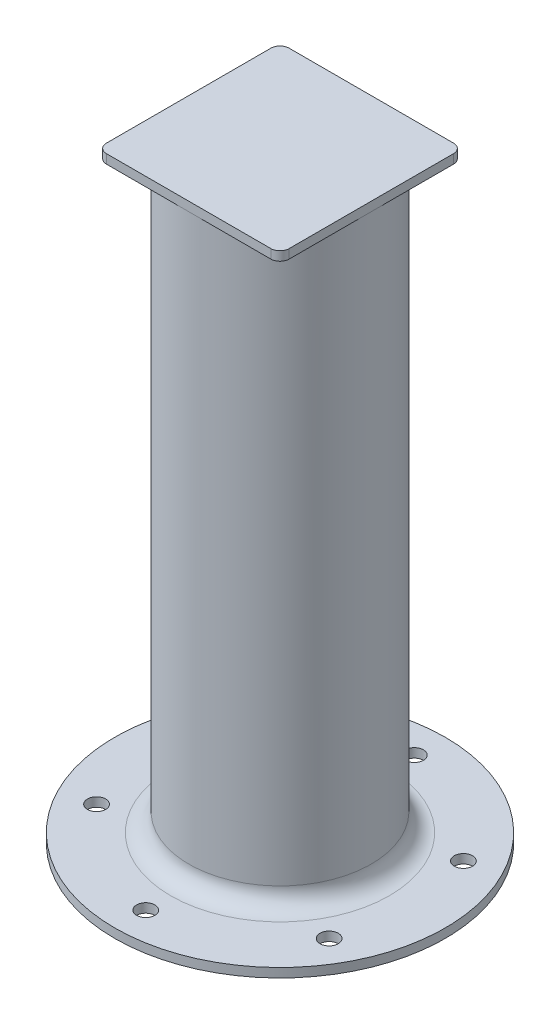
ISO-10303-21;
HEADER;
FILE_DESCRIPTION(('STEP AP214'),'2;1');
FILE_NAME('part.step','',(''),(''),'','','');
FILE_SCHEMA(('AUTOMOTIVE_DESIGN { 1 0 10303 214 1 1 1 1 }'));
ENDSEC;
DATA;
#1=APPLICATION_CONTEXT('core data for automotive mechanical design processes');
#2=APPLICATION_PROTOCOL_DEFINITION('international standard','automotive_design',2000,#1);
#3=PRODUCT_CONTEXT('',#1,'mechanical');
#4=PRODUCT('Part','Part','',(#3));
#5=PRODUCT_RELATED_PRODUCT_CATEGORY('part','',(#4));
#6=PRODUCT_DEFINITION_FORMATION('','',#4);
#7=PRODUCT_DEFINITION_CONTEXT('part definition',#1,'design');
#8=PRODUCT_DEFINITION('design','',#6,#7);
#9=PRODUCT_DEFINITION_SHAPE('','',#8);
#10=(LENGTH_UNIT() NAMED_UNIT(*) SI_UNIT(.MILLI.,.METRE.));
#11=(NAMED_UNIT(*) PLANE_ANGLE_UNIT() SI_UNIT($,.RADIAN.));
#12=(NAMED_UNIT(*) SI_UNIT($,.STERADIAN.) SOLID_ANGLE_UNIT());
#13=UNCERTAINTY_MEASURE_WITH_UNIT(LENGTH_MEASURE(1.E-05),#10,'distance_accuracy_value','');
#14=(GEOMETRIC_REPRESENTATION_CONTEXT(3) GLOBAL_UNCERTAINTY_ASSIGNED_CONTEXT((#13)) GLOBAL_UNIT_ASSIGNED_CONTEXT((#10,
#11,#12)) REPRESENTATION_CONTEXT('',''));
#15=CARTESIAN_POINT('',(0.,0.,0.));
#16=DIRECTION('',(0.,0.,1.));
#17=DIRECTION('',(1.,0.,0.));
#18=AXIS2_PLACEMENT_3D('',#15,#16,#17);
#19=CARTESIAN_POINT('',(0.,325.,0.));
#20=DIRECTION('',(0.,-1.,0.));
#21=DIRECTION('',(0.,0.,-1.));
#22=AXIS2_PLACEMENT_3D('',#19,#20,#21);
#23=CYLINDRICAL_SURFACE('',#22,100.);
#24=CARTESIAN_POINT('',(0.,-300.,0.));
#25=DIRECTION('',(0.,-1.,0.));
#26=DIRECTION('',(0.,0.,-1.));
#27=AXIS2_PLACEMENT_3D('',#24,#25,#26);
#28=CIRCLE('',#27,100.);
#29=CARTESIAN_POINT('',(0.,-300.,-100.));
#30=VERTEX_POINT('',#29);
#31=EDGE_CURVE('E53',#30,#30,#28,.F.);
#32=ORIENTED_EDGE('',*,*,#31,.T.);
#33=EDGE_LOOP('',(#32));
#34=FACE_BOUND('',#33,.T.);
#35=CARTESIAN_POINT('',(0.,320.,0.));
#36=DIRECTION('',(0.,1.,0.));
#37=DIRECTION('',(0.,0.,1.));
#38=AXIS2_PLACEMENT_3D('',#35,#36,#37);
#39=CIRCLE('',#38,100.);
#40=CARTESIAN_POINT('',(0.,320.,100.));
#41=VERTEX_POINT('',#40);
#42=EDGE_CURVE('E11',#41,#41,#39,.T.);
#43=ORIENTED_EDGE('',*,*,#42,.F.);
#44=EDGE_LOOP('',(#43));
#45=FACE_BOUND('',#44,.T.);
#46=ADVANCED_FACE('F43',(#34,#45),#23,.T.);
#47=CARTESIAN_POINT('',(0.,-330.,0.));
#48=DIRECTION('',(0.,-1.,0.));
#49=DIRECTION('',(0.,0.,-1.));
#50=AXIS2_PLACEMENT_3D('',#47,#48,#49);
#51=PLANE('',#50);
#52=CARTESIAN_POINT('',(-127.558453380943,-330.,-73.6459073969141));
#53=DIRECTION('',(0.,-1.,0.));
#54=DIRECTION('',(0.,0.,-1.));
#55=AXIS2_PLACEMENT_3D('',#52,#53,#54);
#56=CIRCLE('',#55,10.0000000000155);
#57=CARTESIAN_POINT('',(-127.558453380943,-330.,-83.6459073969296));
#58=VERTEX_POINT('',#57);
#59=EDGE_CURVE('E199',#58,#58,#56,.T.);
#60=ORIENTED_EDGE('',*,*,#59,.F.);
#61=EDGE_LOOP('',(#60));
#62=FACE_BOUND('',#61,.T.);
#63=CARTESIAN_POINT('',(127.558453380968,-330.,-73.6459073968996));
#64=DIRECTION('',(0.,-1.,0.));
#65=DIRECTION('',(0.,0.,-1.));
#66=AXIS2_PLACEMENT_3D('',#63,#64,#65);
#67=CIRCLE('',#66,10.0000000000106);
#68=CARTESIAN_POINT('',(127.558453380968,-330.,-83.6459073969102));
#69=VERTEX_POINT('',#68);
#70=EDGE_CURVE('E215',#69,#69,#67,.T.);
#71=ORIENTED_EDGE('',*,*,#70,.F.);
#72=EDGE_LOOP('',(#71));
#73=FACE_BOUND('',#72,.T.);
#74=CARTESIAN_POINT('',(0.,-330.,147.291814793814));
#75=DIRECTION('',(0.,-1.,0.));
#76=DIRECTION('',(0.,0.,-1.));
#77=AXIS2_PLACEMENT_3D('',#74,#75,#76);
#78=CIRCLE('',#77,10.);
#79=CARTESIAN_POINT('',(0.,-330.,137.291814793814));
#80=VERTEX_POINT('',#79);
#81=EDGE_CURVE('E231',#80,#80,#78,.T.);
#82=ORIENTED_EDGE('',*,*,#81,.F.);
#83=EDGE_LOOP('',(#82));
#84=FACE_BOUND('',#83,.T.);
#85=CARTESIAN_POINT('',(0.,-330.,0.));
#86=DIRECTION('',(0.,-1.,0.));
#87=DIRECTION('',(0.,0.,-1.));
#88=AXIS2_PLACEMENT_3D('',#85,#86,#87);
#89=CIRCLE('',#88,181.255455070205);
#90=CARTESIAN_POINT('',(0.,-330.,-181.255455070205));
#91=VERTEX_POINT('',#90);
#92=EDGE_CURVE('E239',#91,#91,#89,.T.);
#93=ORIENTED_EDGE('',*,*,#92,.T.);
#94=EDGE_LOOP('',(#93));
#95=FACE_BOUND('',#94,.T.);
#96=CARTESIAN_POINT('',(127.558453380959,-330.,73.6459073969141));
#97=DIRECTION('',(0.,-1.,0.));
#98=DIRECTION('',(0.,0.,-1.));
#99=AXIS2_PLACEMENT_3D('',#96,#97,#98);
#100=CIRCLE('',#99,10.0000000000022);
#101=CARTESIAN_POINT('',(127.558453380959,-330.,63.6459073969119));
#102=VERTEX_POINT('',#101);
#103=EDGE_CURVE('E223',#102,#102,#100,.T.);
#104=ORIENTED_EDGE('',*,*,#103,.F.);
#105=EDGE_LOOP('',(#104));
#106=FACE_BOUND('',#105,.T.);
#107=CARTESIAN_POINT('',(1.66910265113283E-11,-330.,-147.291814793814));
#108=DIRECTION('',(0.,-1.,0.));
#109=DIRECTION('',(0.,0.,-1.));
#110=AXIS2_PLACEMENT_3D('',#107,#108,#109);
#111=CIRCLE('',#110,10.000000000017);
#112=CARTESIAN_POINT('',(1.66910265113283E-11,-330.,-157.291814793831));
#113=VERTEX_POINT('',#112);
#114=EDGE_CURVE('E207',#113,#113,#111,.T.);
#115=ORIENTED_EDGE('',*,*,#114,.F.);
#116=EDGE_LOOP('',(#115));
#117=FACE_BOUND('',#116,.T.);
#118=CARTESIAN_POINT('',(-127.558453380951,-330.,73.6459073968995));
#119=DIRECTION('',(0.,-1.,0.));
#120=DIRECTION('',(0.,0.,-1.));
#121=AXIS2_PLACEMENT_3D('',#118,#119,#120);
#122=CIRCLE('',#121,10.0000000000078);
#123=CARTESIAN_POINT('',(-127.558453380951,-330.,63.6459073968917));
#124=VERTEX_POINT('',#123);
#125=EDGE_CURVE('E191',#124,#124,#122,.T.);
#126=ORIENTED_EDGE('',*,*,#125,.F.);
#127=EDGE_LOOP('',(#126));
#128=FACE_BOUND('',#127,.T.);
#129=ADVANCED_FACE('F265',(#62,#73,#84,#95,#106,#117,#128),#51,.T.);
#130=CARTESIAN_POINT('',(0.,-320.,0.));
#131=DIRECTION('',(0.,-1.,0.));
#132=DIRECTION('',(0.,0.,-1.));
#133=AXIS2_PLACEMENT_3D('',#130,#131,#132);
#134=PLANE('',#133);
#135=CARTESIAN_POINT('',(0.,-320.,0.));
#136=DIRECTION('',(0.,-1.,0.));
#137=DIRECTION('',(0.,0.,-1.));
#138=AXIS2_PLACEMENT_3D('',#135,#136,#137);
#139=CIRCLE('',#138,120.);
#140=CARTESIAN_POINT('',(0.,-320.,-120.));
#141=VERTEX_POINT('',#140);
#142=EDGE_CURVE('E243',#141,#141,#139,.T.);
#143=ORIENTED_EDGE('',*,*,#142,.T.);
#144=EDGE_LOOP('',(#143));
#145=FACE_BOUND('',#144,.T.);
#146=CARTESIAN_POINT('',(0.,-320.,0.));
#147=DIRECTION('',(0.,-1.,0.));
#148=DIRECTION('',(0.,0.,-1.));
#149=AXIS2_PLACEMENT_3D('',#146,#147,#148);
#150=CIRCLE('',#149,181.255455070205);
#151=CARTESIAN_POINT('',(0.,-320.,-181.255455070205));
#152=VERTEX_POINT('',#151);
#153=EDGE_CURVE('E235',#152,#152,#150,.T.);
#154=ORIENTED_EDGE('',*,*,#153,.F.);
#155=EDGE_LOOP('',(#154));
#156=FACE_BOUND('',#155,.T.);
#157=CARTESIAN_POINT('',(0.,-320.,147.291814793814));
#158=DIRECTION('',(0.,-1.,0.));
#159=DIRECTION('',(0.,0.,-1.));
#160=AXIS2_PLACEMENT_3D('',#157,#158,#159);
#161=CIRCLE('',#160,10.);
#162=CARTESIAN_POINT('',(0.,-320.,137.291814793814));
#163=VERTEX_POINT('',#162);
#164=EDGE_CURVE('E227',#163,#163,#161,.T.);
#165=ORIENTED_EDGE('',*,*,#164,.T.);
#166=EDGE_LOOP('',(#165));
#167=FACE_BOUND('',#166,.T.);
#168=CARTESIAN_POINT('',(127.558453380959,-320.,73.6459073969141));
#169=DIRECTION('',(0.,-1.,0.));
#170=DIRECTION('',(0.,0.,-1.));
#171=AXIS2_PLACEMENT_3D('',#168,#169,#170);
#172=CIRCLE('',#171,10.0000000000022);
#173=CARTESIAN_POINT('',(127.558453380959,-320.,63.6459073969119));
#174=VERTEX_POINT('',#173);
#175=EDGE_CURVE('E219',#174,#174,#172,.T.);
#176=ORIENTED_EDGE('',*,*,#175,.T.);
#177=EDGE_LOOP('',(#176));
#178=FACE_BOUND('',#177,.T.);
#179=CARTESIAN_POINT('',(127.558453380968,-320.,-73.6459073968996));
#180=DIRECTION('',(0.,-1.,0.));
#181=DIRECTION('',(0.,0.,-1.));
#182=AXIS2_PLACEMENT_3D('',#179,#180,#181);
#183=CIRCLE('',#182,10.0000000000106);
#184=CARTESIAN_POINT('',(127.558453380968,-320.,-83.6459073969102));
#185=VERTEX_POINT('',#184);
#186=EDGE_CURVE('E211',#185,#185,#183,.T.);
#187=ORIENTED_EDGE('',*,*,#186,.T.);
#188=EDGE_LOOP('',(#187));
#189=FACE_BOUND('',#188,.T.);
#190=CARTESIAN_POINT('',(1.66910265113283E-11,-320.,-147.291814793814));
#191=DIRECTION('',(0.,-1.,0.));
#192=DIRECTION('',(0.,0.,-1.));
#193=AXIS2_PLACEMENT_3D('',#190,#191,#192);
#194=CIRCLE('',#193,10.000000000017);
#195=CARTESIAN_POINT('',(1.66910265113283E-11,-320.,-157.291814793831));
#196=VERTEX_POINT('',#195);
#197=EDGE_CURVE('E203',#196,#196,#194,.T.);
#198=ORIENTED_EDGE('',*,*,#197,.T.);
#199=EDGE_LOOP('',(#198));
#200=FACE_BOUND('',#199,.T.);
#201=CARTESIAN_POINT('',(-127.558453380943,-320.,-73.6459073969141));
#202=DIRECTION('',(0.,-1.,0.));
#203=DIRECTION('',(0.,0.,-1.));
#204=AXIS2_PLACEMENT_3D('',#201,#202,#203);
#205=CIRCLE('',#204,10.0000000000155);
#206=CARTESIAN_POINT('',(-127.558453380943,-320.,-83.6459073969296));
#207=VERTEX_POINT('',#206);
#208=EDGE_CURVE('E195',#207,#207,#205,.T.);
#209=ORIENTED_EDGE('',*,*,#208,.T.);
#210=EDGE_LOOP('',(#209));
#211=FACE_BOUND('',#210,.T.);
#212=CARTESIAN_POINT('',(-127.558453380951,-320.,73.6459073968995));
#213=DIRECTION('',(0.,-1.,0.));
#214=DIRECTION('',(0.,0.,-1.));
#215=AXIS2_PLACEMENT_3D('',#212,#213,#214);
#216=CIRCLE('',#215,10.0000000000078);
#217=CARTESIAN_POINT('',(-127.558453380951,-320.,63.6459073968917));
#218=VERTEX_POINT('',#217);
#219=EDGE_CURVE('E190',#218,#218,#216,.T.);
#220=ORIENTED_EDGE('',*,*,#219,.T.);
#221=EDGE_LOOP('',(#220));
#222=FACE_BOUND('',#221,.T.);
#223=ADVANCED_FACE('F261',(#145,#156,#167,#178,#189,#200,#211,#222),#134,.F.);
#224=CARTESIAN_POINT('',(0.,-330.,0.));
#225=DIRECTION('',(0.,1.,0.));
#226=DIRECTION('',(0.,0.,1.));
#227=AXIS2_PLACEMENT_3D('',#224,#225,#226);
#228=CYLINDRICAL_SURFACE('',#227,181.255455070205);
#229=ORIENTED_EDGE('',*,*,#92,.F.);
#230=EDGE_LOOP('',(#229));
#231=FACE_BOUND('',#230,.T.);
#232=ORIENTED_EDGE('',*,*,#153,.T.);
#233=EDGE_LOOP('',(#232));
#234=FACE_BOUND('',#233,.T.);
#235=ADVANCED_FACE('F264',(#231,#234),#228,.T.);
#236=CARTESIAN_POINT('',(0.,-330.,147.291814793814));
#237=DIRECTION('',(0.,1.,0.));
#238=DIRECTION('',(0.,0.,1.));
#239=AXIS2_PLACEMENT_3D('',#236,#237,#238);
#240=CYLINDRICAL_SURFACE('',#239,10.);
#241=ORIENTED_EDGE('',*,*,#81,.T.);
#242=EDGE_LOOP('',(#241));
#243=FACE_BOUND('',#242,.T.);
#244=ORIENTED_EDGE('',*,*,#164,.F.);
#245=EDGE_LOOP('',(#244));
#246=FACE_BOUND('',#245,.T.);
#247=ADVANCED_FACE('F300',(#243,#246),#240,.F.);
#248=CARTESIAN_POINT('',(127.558453380959,-330.,73.6459073969141));
#249=DIRECTION('',(0.,1.,0.));
#250=DIRECTION('',(0.,0.,1.));
#251=AXIS2_PLACEMENT_3D('',#248,#249,#250);
#252=CYLINDRICAL_SURFACE('',#251,10.0000000000022);
#253=ORIENTED_EDGE('',*,*,#103,.T.);
#254=EDGE_LOOP('',(#253));
#255=FACE_BOUND('',#254,.T.);
#256=ORIENTED_EDGE('',*,*,#175,.F.);
#257=EDGE_LOOP('',(#256));
#258=FACE_BOUND('',#257,.T.);
#259=ADVANCED_FACE('F305',(#255,#258),#252,.F.);
#260=CARTESIAN_POINT('',(127.558453380968,-330.,-73.6459073968996));
#261=DIRECTION('',(0.,1.,0.));
#262=DIRECTION('',(0.,0.,1.));
#263=AXIS2_PLACEMENT_3D('',#260,#261,#262);
#264=CYLINDRICAL_SURFACE('',#263,10.0000000000106);
#265=ORIENTED_EDGE('',*,*,#70,.T.);
#266=EDGE_LOOP('',(#265));
#267=FACE_BOUND('',#266,.T.);
#268=ORIENTED_EDGE('',*,*,#186,.F.);
#269=EDGE_LOOP('',(#268));
#270=FACE_BOUND('',#269,.T.);
#271=ADVANCED_FACE('F309',(#267,#270),#264,.F.);
#272=CARTESIAN_POINT('',(1.66910265113283E-11,-330.,-147.291814793814));
#273=DIRECTION('',(0.,1.,0.));
#274=DIRECTION('',(0.,0.,1.));
#275=AXIS2_PLACEMENT_3D('',#272,#273,#274);
#276=CYLINDRICAL_SURFACE('',#275,10.000000000017);
#277=ORIENTED_EDGE('',*,*,#114,.T.);
#278=EDGE_LOOP('',(#277));
#279=FACE_BOUND('',#278,.T.);
#280=ORIENTED_EDGE('',*,*,#197,.F.);
#281=EDGE_LOOP('',(#280));
#282=FACE_BOUND('',#281,.T.);
#283=ADVANCED_FACE('F288',(#279,#282),#276,.F.);
#284=CARTESIAN_POINT('',(-127.558453380943,-330.,-73.6459073969141));
#285=DIRECTION('',(0.,1.,0.));
#286=DIRECTION('',(0.,0.,1.));
#287=AXIS2_PLACEMENT_3D('',#284,#285,#286);
#288=CYLINDRICAL_SURFACE('',#287,10.0000000000155);
#289=ORIENTED_EDGE('',*,*,#59,.T.);
#290=EDGE_LOOP('',(#289));
#291=FACE_BOUND('',#290,.T.);
#292=ORIENTED_EDGE('',*,*,#208,.F.);
#293=EDGE_LOOP('',(#292));
#294=FACE_BOUND('',#293,.T.);
#295=ADVANCED_FACE('F282',(#291,#294),#288,.F.);
#296=CARTESIAN_POINT('',(-127.558453380951,-330.,73.6459073968995));
#297=DIRECTION('',(0.,1.,0.));
#298=DIRECTION('',(0.,0.,1.));
#299=AXIS2_PLACEMENT_3D('',#296,#297,#298);
#300=CYLINDRICAL_SURFACE('',#299,10.0000000000078);
#301=ORIENTED_EDGE('',*,*,#125,.T.);
#302=EDGE_LOOP('',(#301));
#303=FACE_BOUND('',#302,.T.);
#304=ORIENTED_EDGE('',*,*,#219,.F.);
#305=EDGE_LOOP('',(#304));
#306=FACE_BOUND('',#305,.T.);
#307=ADVANCED_FACE('F258',(#303,#306),#300,.F.);
#308=CARTESIAN_POINT('',(0.,-300.,0.));
#309=DIRECTION('',(0.,-1.,0.));
#310=DIRECTION('',(0.,0.,-1.));
#311=AXIS2_PLACEMENT_3D('',#308,#309,#310);
#312=TOROIDAL_SURFACE('',#311,120.,20.);
#313=ORIENTED_EDGE('',*,*,#31,.F.);
#314=EDGE_LOOP('',(#313));
#315=FACE_BOUND('',#314,.T.);
#316=ORIENTED_EDGE('',*,*,#142,.F.);
#317=EDGE_LOOP('',(#316));
#318=FACE_BOUND('',#317,.T.);
#319=ADVANCED_FACE('F45',(#315,#318),#312,.F.);
#320=CARTESIAN_POINT('',(90.1939705175204,330.,90.1939705175203));
#321=DIRECTION('',(0.,-1.,0.));
#322=DIRECTION('',(0.,0.,-1.));
#323=AXIS2_PLACEMENT_3D('',#320,#321,#322);
#324=CYLINDRICAL_SURFACE('',#323,9.99999999999999);
#325=CARTESIAN_POINT('',(90.1939705175204,320.,90.1939705175203));
#326=DIRECTION('',(0.,1.,0.));
#327=DIRECTION('',(0.,0.,1.));
#328=AXIS2_PLACEMENT_3D('',#325,#326,#327);
#329=CIRCLE('',#328,9.99999999999999);
#330=CARTESIAN_POINT('',(90.1939705175203,320.,100.19397051752));
#331=VERTEX_POINT('',#330);
#332=CARTESIAN_POINT('',(100.19397051752,320.,90.1939705175203));
#333=VERTEX_POINT('',#332);
#334=EDGE_CURVE('E146',#331,#333,#329,.T.);
#335=ORIENTED_EDGE('',*,*,#334,.T.);
#336=DIRECTION('',(0.,-1.,0.));
#337=VECTOR('',#336,1.);
#338=CARTESIAN_POINT('',(100.19397051752,330.,90.1939705175203));
#339=LINE('',#338,#337);
#340=CARTESIAN_POINT('',(100.19397051752,330.,90.1939705175203));
#341=VERTEX_POINT('',#340);
#342=EDGE_CURVE('E187',#341,#333,#339,.T.);
#343=ORIENTED_EDGE('',*,*,#342,.F.);
#344=CARTESIAN_POINT('',(90.1939705175204,330.,90.1939705175203));
#345=DIRECTION('',(0.,1.,0.));
#346=DIRECTION('',(0.,0.,1.));
#347=AXIS2_PLACEMENT_3D('',#344,#345,#346);
#348=CIRCLE('',#347,9.99999999999999);
#349=CARTESIAN_POINT('',(90.1939705175203,330.,100.19397051752));
#350=VERTEX_POINT('',#349);
#351=EDGE_CURVE('E168',#350,#341,#348,.T.);
#352=ORIENTED_EDGE('',*,*,#351,.F.);
#353=DIRECTION('',(0.,-1.,0.));
#354=VECTOR('',#353,1.);
#355=CARTESIAN_POINT('',(90.1939705175203,330.,100.19397051752));
#356=LINE('',#355,#354);
#357=EDGE_CURVE('E142',#350,#331,#356,.T.);
#358=ORIENTED_EDGE('',*,*,#357,.T.);
#359=EDGE_LOOP('',(#335,#343,#352,#358));
#360=FACE_BOUND('',#359,.T.);
#361=ADVANCED_FACE('F257',(#360),#324,.T.);
#362=CARTESIAN_POINT('',(100.19397051752,330.,90.1939705175203));
#363=DIRECTION('',(-1.,0.,0.));
#364=DIRECTION('',(0.,0.,1.));
#365=AXIS2_PLACEMENT_3D('',#362,#363,#364);
#366=PLANE('',#365);
#367=DIRECTION('',(0.,0.,-1.));
#368=VECTOR('',#367,1.);
#369=CARTESIAN_POINT('',(100.19397051752,320.,90.1939705175203));
#370=LINE('',#369,#368);
#371=CARTESIAN_POINT('',(100.19397051752,320.,-90.1939705175203));
#372=VERTEX_POINT('',#371);
#373=EDGE_CURVE('E150',#333,#372,#370,.T.);
#374=ORIENTED_EDGE('',*,*,#373,.T.);
#375=DIRECTION('',(0.,-1.,0.));
#376=VECTOR('',#375,1.);
#377=CARTESIAN_POINT('',(100.19397051752,330.,-90.1939705175203));
#378=LINE('',#377,#376);
#379=CARTESIAN_POINT('',(100.19397051752,330.,-90.1939705175203));
#380=VERTEX_POINT('',#379);
#381=EDGE_CURVE('E183',#380,#372,#378,.T.);
#382=ORIENTED_EDGE('',*,*,#381,.F.);
#383=DIRECTION('',(0.,0.,-1.));
#384=VECTOR('',#383,1.);
#385=CARTESIAN_POINT('',(100.19397051752,330.,90.1939705175203));
#386=LINE('',#385,#384);
#387=EDGE_CURVE('E105',#341,#380,#386,.T.);
#388=ORIENTED_EDGE('',*,*,#387,.F.);
#389=ORIENTED_EDGE('',*,*,#342,.T.);
#390=EDGE_LOOP('',(#374,#382,#388,#389));
#391=FACE_BOUND('',#390,.T.);
#392=ADVANCED_FACE('F365',(#391),#366,.F.);
#393=CARTESIAN_POINT('',(90.1939705175204,330.,-90.1939705175203));
#394=DIRECTION('',(0.,-1.,0.));
#395=DIRECTION('',(0.,0.,-1.));
#396=AXIS2_PLACEMENT_3D('',#393,#394,#395);
#397=CYLINDRICAL_SURFACE('',#396,9.99999999999999);
#398=CARTESIAN_POINT('',(90.1939705175204,320.,-90.1939705175203));
#399=DIRECTION('',(0.,1.,0.));
#400=DIRECTION('',(0.,0.,-1.));
#401=AXIS2_PLACEMENT_3D('',#398,#399,#400);
#402=CIRCLE('',#401,9.99999999999999);
#403=CARTESIAN_POINT('',(90.1939705175203,320.,-100.19397051752));
#404=VERTEX_POINT('',#403);
#405=EDGE_CURVE('E153',#372,#404,#402,.T.);
#406=ORIENTED_EDGE('',*,*,#405,.T.);
#407=DIRECTION('',(0.,-1.,0.));
#408=VECTOR('',#407,1.);
#409=CARTESIAN_POINT('',(90.1939705175203,330.,-100.19397051752));
#410=LINE('',#409,#408);
#411=CARTESIAN_POINT('',(90.1939705175203,330.,-100.19397051752));
#412=VERTEX_POINT('',#411);
#413=EDGE_CURVE('E179',#412,#404,#410,.T.);
#414=ORIENTED_EDGE('',*,*,#413,.F.);
#415=CARTESIAN_POINT('',(90.1939705175204,330.,-90.1939705175203));
#416=DIRECTION('',(0.,1.,0.));
#417=DIRECTION('',(0.,0.,-1.));
#418=AXIS2_PLACEMENT_3D('',#415,#416,#417);
#419=CIRCLE('',#418,9.99999999999999);
#420=EDGE_CURVE('E524',#380,#412,#419,.T.);
#421=ORIENTED_EDGE('',*,*,#420,.F.);
#422=ORIENTED_EDGE('',*,*,#381,.T.);
#423=EDGE_LOOP('',(#406,#414,#421,#422));
#424=FACE_BOUND('',#423,.T.);
#425=ADVANCED_FACE('F375',(#424),#397,.T.);
#426=CARTESIAN_POINT('',(-90.1939705175203,330.,-100.19397051752));
#427=DIRECTION('',(0.,0.,1.));
#428=DIRECTION('',(1.,0.,0.));
#429=AXIS2_PLACEMENT_3D('',#426,#427,#428);
#430=PLANE('',#429);
#431=DIRECTION('',(-1.,0.,0.));
#432=VECTOR('',#431,1.);
#433=CARTESIAN_POINT('',(-90.1939705175203,320.,-100.19397051752));
#434=LINE('',#433,#432);
#435=CARTESIAN_POINT('',(-90.1939705175181,320.,-100.19397051752));
#436=VERTEX_POINT('',#435);
#437=EDGE_CURVE('E156',#404,#436,#434,.T.);
#438=ORIENTED_EDGE('',*,*,#437,.T.);
#439=DIRECTION('',(0.,-1.,0.));
#440=VECTOR('',#439,1.);
#441=CARTESIAN_POINT('',(-90.1939705175181,330.,-100.19397051752));
#442=LINE('',#441,#440);
#443=CARTESIAN_POINT('',(-90.1939705175181,330.,-100.19397051752));
#444=VERTEX_POINT('',#443);
#445=EDGE_CURVE('E175',#444,#436,#442,.T.);
#446=ORIENTED_EDGE('',*,*,#445,.F.);
#447=DIRECTION('',(-1.,0.,0.));
#448=VECTOR('',#447,1.);
#449=CARTESIAN_POINT('',(-90.1939705175203,330.,-100.19397051752));
#450=LINE('',#449,#448);
#451=EDGE_CURVE('E529',#412,#444,#450,.T.);
#452=ORIENTED_EDGE('',*,*,#451,.F.);
#453=ORIENTED_EDGE('',*,*,#413,.T.);
#454=EDGE_LOOP('',(#438,#446,#452,#453));
#455=FACE_BOUND('',#454,.T.);
#456=ADVANCED_FACE('F385',(#455),#430,.F.);
#457=CARTESIAN_POINT('',(-90.1939705175181,330.,-90.1939705175203));
#458=DIRECTION('',(0.,-1.,0.));
#459=DIRECTION('',(0.,0.,-1.));
#460=AXIS2_PLACEMENT_3D('',#457,#458,#459);
#461=CYLINDRICAL_SURFACE('',#460,9.99999999999999);
#462=CARTESIAN_POINT('',(-90.1939705175181,320.,-90.1939705175203));
#463=DIRECTION('',(0.,1.,0.));
#464=DIRECTION('',(0.,0.,-1.));
#465=AXIS2_PLACEMENT_3D('',#462,#463,#464);
#466=CIRCLE('',#465,9.99999999999999);
#467=CARTESIAN_POINT('',(-100.193970517518,320.,-90.1939705175203));
#468=VERTEX_POINT('',#467);
#469=EDGE_CURVE('E159',#436,#468,#466,.T.);
#470=ORIENTED_EDGE('',*,*,#469,.T.);
#471=DIRECTION('',(0.,-1.,0.));
#472=VECTOR('',#471,1.);
#473=CARTESIAN_POINT('',(-100.193970517518,330.,-90.1939705175203));
#474=LINE('',#473,#472);
#475=CARTESIAN_POINT('',(-100.193970517518,330.,-90.1939705175203));
#476=VERTEX_POINT('',#475);
#477=EDGE_CURVE('E135',#476,#468,#474,.T.);
#478=ORIENTED_EDGE('',*,*,#477,.F.);
#479=CARTESIAN_POINT('',(-90.1939705175181,330.,-90.1939705175203));
#480=DIRECTION('',(0.,1.,0.));
#481=DIRECTION('',(0.,0.,-1.));
#482=AXIS2_PLACEMENT_3D('',#479,#480,#481);
#483=CIRCLE('',#482,9.99999999999999);
#484=EDGE_CURVE('E124',#444,#476,#483,.T.);
#485=ORIENTED_EDGE('',*,*,#484,.F.);
#486=ORIENTED_EDGE('',*,*,#445,.T.);
#487=EDGE_LOOP('',(#470,#478,#485,#486));
#488=FACE_BOUND('',#487,.T.);
#489=ADVANCED_FACE('F396',(#488),#461,.T.);
#490=CARTESIAN_POINT('',(-100.193970517518,330.,90.1939705175203));
#491=DIRECTION('',(1.,0.,0.));
#492=DIRECTION('',(0.,0.,-1.));
#493=AXIS2_PLACEMENT_3D('',#490,#491,#492);
#494=PLANE('',#493);
#495=DIRECTION('',(0.,0.,1.));
#496=VECTOR('',#495,1.);
#497=CARTESIAN_POINT('',(-100.193970517518,320.,90.1939705175203));
#498=LINE('',#497,#496);
#499=CARTESIAN_POINT('',(-100.193970517518,320.,90.1939705175203));
#500=VERTEX_POINT('',#499);
#501=EDGE_CURVE('E133',#468,#500,#498,.T.);
#502=ORIENTED_EDGE('',*,*,#501,.T.);
#503=DIRECTION('',(0.,-1.,0.));
#504=VECTOR('',#503,1.);
#505=CARTESIAN_POINT('',(-100.193970517518,330.,90.1939705175203));
#506=LINE('',#505,#504);
#507=CARTESIAN_POINT('',(-100.193970517518,330.,90.1939705175203));
#508=VERTEX_POINT('',#507);
#509=EDGE_CURVE('E130',#508,#500,#506,.T.);
#510=ORIENTED_EDGE('',*,*,#509,.F.);
#511=DIRECTION('',(0.,0.,1.));
#512=VECTOR('',#511,1.);
#513=CARTESIAN_POINT('',(-100.193970517518,330.,90.1939705175203));
#514=LINE('',#513,#512);
#515=EDGE_CURVE('E118',#476,#508,#514,.T.);
#516=ORIENTED_EDGE('',*,*,#515,.F.);
#517=ORIENTED_EDGE('',*,*,#477,.T.);
#518=EDGE_LOOP('',(#502,#510,#516,#517));
#519=FACE_BOUND('',#518,.T.);
#520=ADVANCED_FACE('F131',(#519),#494,.F.);
#521=CARTESIAN_POINT('',(-90.1939705175181,330.,90.1939705175203));
#522=DIRECTION('',(0.,-1.,0.));
#523=DIRECTION('',(0.,0.,-1.));
#524=AXIS2_PLACEMENT_3D('',#521,#522,#523);
#525=CYLINDRICAL_SURFACE('',#524,9.99999999999999);
#526=CARTESIAN_POINT('',(-90.1939705175181,320.,90.1939705175203));
#527=DIRECTION('',(0.,1.,0.));
#528=DIRECTION('',(0.,0.,-1.));
#529=AXIS2_PLACEMENT_3D('',#526,#527,#528);
#530=CIRCLE('',#529,9.99999999999999);
#531=CARTESIAN_POINT('',(-90.1939705175203,320.,100.19397051752));
#532=VERTEX_POINT('',#531);
#533=EDGE_CURVE('E90',#500,#532,#530,.T.);
#534=ORIENTED_EDGE('',*,*,#533,.T.);
#535=DIRECTION('',(0.,-1.,0.));
#536=VECTOR('',#535,1.);
#537=CARTESIAN_POINT('',(-90.1939705175203,330.,100.19397051752));
#538=LINE('',#537,#536);
#539=CARTESIAN_POINT('',(-90.1939705175203,330.,100.19397051752));
#540=VERTEX_POINT('',#539);
#541=EDGE_CURVE('E136',#540,#532,#538,.T.);
#542=ORIENTED_EDGE('',*,*,#541,.F.);
#543=CARTESIAN_POINT('',(-90.1939705175181,330.,90.1939705175203));
#544=DIRECTION('',(0.,1.,0.));
#545=DIRECTION('',(0.,0.,-1.));
#546=AXIS2_PLACEMENT_3D('',#543,#544,#545);
#547=CIRCLE('',#546,9.99999999999999);
#548=EDGE_CURVE('E122',#508,#540,#547,.T.);
#549=ORIENTED_EDGE('',*,*,#548,.F.);
#550=ORIENTED_EDGE('',*,*,#509,.T.);
#551=EDGE_LOOP('',(#534,#542,#549,#550));
#552=FACE_BOUND('',#551,.T.);
#553=ADVANCED_FACE('F138',(#552),#525,.T.);
#554=CARTESIAN_POINT('',(-90.1939705175203,330.,100.19397051752));
#555=DIRECTION('',(0.,0.,-1.));
#556=DIRECTION('',(-1.,0.,0.));
#557=AXIS2_PLACEMENT_3D('',#554,#555,#556);
#558=PLANE('',#557);
#559=DIRECTION('',(1.,0.,0.));
#560=VECTOR('',#559,1.);
#561=CARTESIAN_POINT('',(-90.1939705175203,320.,100.19397051752));
#562=LINE('',#561,#560);
#563=EDGE_CURVE('E96',#532,#331,#562,.T.);
#564=ORIENTED_EDGE('',*,*,#563,.T.);
#565=ORIENTED_EDGE('',*,*,#357,.F.);
#566=DIRECTION('',(1.,0.,0.));
#567=VECTOR('',#566,1.);
#568=CARTESIAN_POINT('',(-90.1939705175203,330.,100.19397051752));
#569=LINE('',#568,#567);
#570=EDGE_CURVE('E61',#540,#350,#569,.T.);
#571=ORIENTED_EDGE('',*,*,#570,.F.);
#572=ORIENTED_EDGE('',*,*,#541,.T.);
#573=EDGE_LOOP('',(#564,#565,#571,#572));
#574=FACE_BOUND('',#573,.T.);
#575=ADVANCED_FACE('F426',(#574),#558,.F.);
#576=CARTESIAN_POINT('',(90.1939705175204,330.,90.1939705175203));
#577=DIRECTION('',(0.,1.,0.));
#578=DIRECTION('',(0.,0.,1.));
#579=AXIS2_PLACEMENT_3D('',#576,#577,#578);
#580=PLANE('',#579);
#581=ORIENTED_EDGE('',*,*,#351,.T.);
#582=ORIENTED_EDGE('',*,*,#387,.T.);
#583=ORIENTED_EDGE('',*,*,#420,.T.);
#584=ORIENTED_EDGE('',*,*,#451,.T.);
#585=ORIENTED_EDGE('',*,*,#484,.T.);
#586=ORIENTED_EDGE('',*,*,#515,.T.);
#587=ORIENTED_EDGE('',*,*,#548,.T.);
#588=ORIENTED_EDGE('',*,*,#570,.T.);
#589=EDGE_LOOP('',(#581,#582,#583,#584,#585,#586,#587,#588));
#590=FACE_BOUND('',#589,.T.);
#591=ADVANCED_FACE('F120',(#590),#580,.T.);
#592=CARTESIAN_POINT('',(90.1939705175204,320.,90.1939705175203));
#593=DIRECTION('',(0.,1.,0.));
#594=DIRECTION('',(0.,0.,1.));
#595=AXIS2_PLACEMENT_3D('',#592,#593,#594);
#596=PLANE('',#595);
#597=ORIENTED_EDGE('',*,*,#42,.T.);
#598=EDGE_LOOP('',(#597));
#599=FACE_BOUND('',#598,.T.);
#600=ORIENTED_EDGE('',*,*,#334,.F.);
#601=ORIENTED_EDGE('',*,*,#563,.F.);
#602=ORIENTED_EDGE('',*,*,#533,.F.);
#603=ORIENTED_EDGE('',*,*,#501,.F.);
#604=ORIENTED_EDGE('',*,*,#469,.F.);
#605=ORIENTED_EDGE('',*,*,#437,.F.);
#606=ORIENTED_EDGE('',*,*,#405,.F.);
#607=ORIENTED_EDGE('',*,*,#373,.F.);
#608=EDGE_LOOP('',(#600,#601,#602,#603,#604,#605,#606,#607));
#609=FACE_BOUND('',#608,.T.);
#610=ADVANCED_FACE('F445',(#599,#609),#596,.F.);
#611=CLOSED_SHELL('',(#46,#129,#223,#235,#247,#259,#271,#283,#295,#307,#319,#361,#392,#425,#456,
#489,#520,#553,#575,#591,#610));
#612=MANIFOLD_SOLID_BREP('B2',#611);
#613=ADVANCED_BREP_SHAPE_REPRESENTATION('',(#18,#612),#14);
#614=SHAPE_DEFINITION_REPRESENTATION(#9,#613);
ENDSEC;
END-ISO-10303-21;
